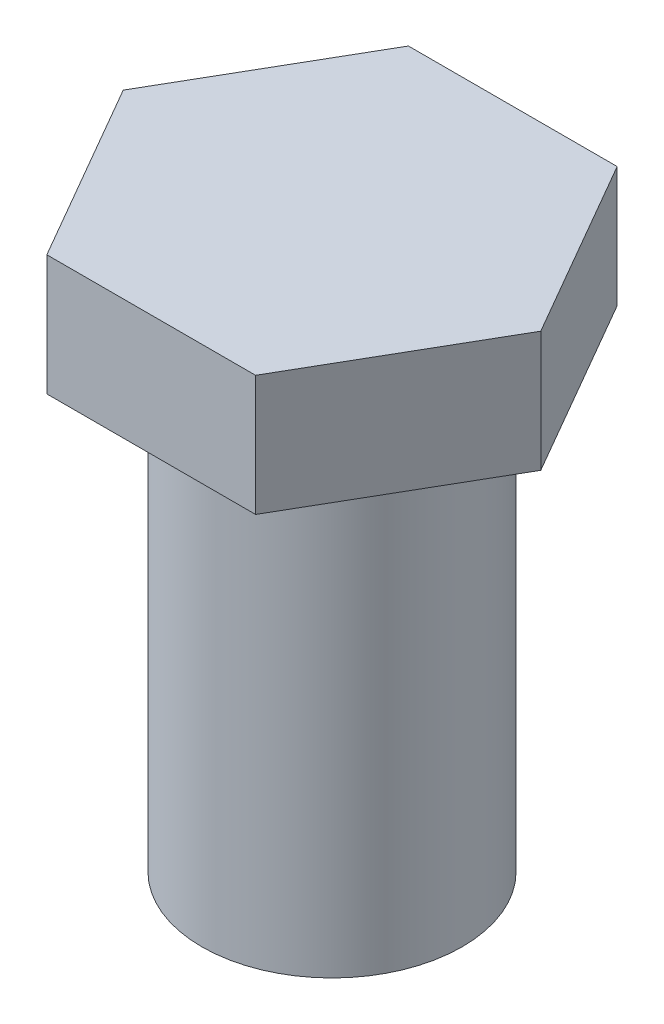
ISO-10303-21;
HEADER;
FILE_DESCRIPTION(('STEP AP214'),'2;1');
FILE_NAME('part.step','',(''),(''),'','','');
FILE_SCHEMA(('AUTOMOTIVE_DESIGN { 1 0 10303 214 1 1 1 1 }'));
ENDSEC;
DATA;
#1=APPLICATION_CONTEXT('core data for automotive mechanical design processes');
#2=APPLICATION_PROTOCOL_DEFINITION('international standard','automotive_design',2000,#1);
#3=PRODUCT_CONTEXT('',#1,'mechanical');
#4=PRODUCT('Part','Part','',(#3));
#5=PRODUCT_RELATED_PRODUCT_CATEGORY('part','',(#4));
#6=PRODUCT_DEFINITION_FORMATION('','',#4);
#7=PRODUCT_DEFINITION_CONTEXT('part definition',#1,'design');
#8=PRODUCT_DEFINITION('design','',#6,#7);
#9=PRODUCT_DEFINITION_SHAPE('','',#8);
#10=(LENGTH_UNIT() NAMED_UNIT(*) SI_UNIT(.MILLI.,.METRE.));
#11=(NAMED_UNIT(*) PLANE_ANGLE_UNIT() SI_UNIT($,.RADIAN.));
#12=(NAMED_UNIT(*) SI_UNIT($,.STERADIAN.) SOLID_ANGLE_UNIT());
#13=UNCERTAINTY_MEASURE_WITH_UNIT(LENGTH_MEASURE(1.E-05),#10,'distance_accuracy_value','');
#14=(GEOMETRIC_REPRESENTATION_CONTEXT(3) GLOBAL_UNCERTAINTY_ASSIGNED_CONTEXT((#13)) GLOBAL_UNIT_ASSIGNED_CONTEXT((#10,
#11,#12)) REPRESENTATION_CONTEXT('',''));
#15=CARTESIAN_POINT('',(0.,0.,0.));
#16=DIRECTION('',(0.,0.,1.));
#17=DIRECTION('',(1.,0.,0.));
#18=AXIS2_PLACEMENT_3D('',#15,#16,#17);
#19=CARTESIAN_POINT('',(0.,-9.525,0.));
#20=DIRECTION('',(0.,1.,0.));
#21=DIRECTION('',(0.,0.,1.));
#22=AXIS2_PLACEMENT_3D('',#19,#20,#21);
#23=CYLINDRICAL_SURFACE('',#22,2.7432);
#24=CARTESIAN_POINT('',(0.,-9.525,0.));
#25=DIRECTION('',(0.,1.,0.));
#26=DIRECTION('',(0.,0.,1.));
#27=AXIS2_PLACEMENT_3D('',#24,#25,#26);
#28=CIRCLE('',#27,2.7432);
#29=CARTESIAN_POINT('',(0.,-9.525,2.7432));
#30=VERTEX_POINT('',#29);
#31=EDGE_CURVE('E11',#30,#30,#28,.T.);
#32=CARTESIAN_POINT('',(0.,0.,0.));
#33=DIRECTION('',(0.,1.,0.));
#34=DIRECTION('',(0.,0.,1.));
#35=AXIS2_PLACEMENT_3D('',#32,#33,#34);
#36=CIRCLE('',#35,2.7432);
#37=CARTESIAN_POINT('',(0.,0.,2.7432));
#38=VERTEX_POINT('',#37);
#39=EDGE_CURVE('E37',#38,#38,#36,.T.);
#40=CARTESIAN_POINT('',(0.,-9.525,2.7432));
#41=CARTESIAN_POINT('',(0.,-9.42578125,2.7432));
#42=CARTESIAN_POINT('',(0.,-9.3265625,2.7432));
#43=CARTESIAN_POINT('',(0.,-9.128125,2.7432));
#44=CARTESIAN_POINT('',(0.,-9.02890625,2.7432));
#45=CARTESIAN_POINT('',(0.,-8.83046875,2.7432));
#46=CARTESIAN_POINT('',(0.,-8.73125,2.7432));
#47=CARTESIAN_POINT('',(0.,-8.5328125,2.7432));
#48=CARTESIAN_POINT('',(0.,-8.43359375,2.7432));
#49=CARTESIAN_POINT('',(0.,-8.23515625,2.7432));
#50=CARTESIAN_POINT('',(0.,-8.1359375,2.7432));
#51=CARTESIAN_POINT('',(0.,-7.9375,2.7432));
#52=CARTESIAN_POINT('',(0.,-7.83828125,2.7432));
#53=CARTESIAN_POINT('',(0.,-7.63984375,2.7432));
#54=CARTESIAN_POINT('',(0.,-7.540625,2.7432));
#55=CARTESIAN_POINT('',(0.,-7.3421875,2.7432));
#56=CARTESIAN_POINT('',(0.,-7.24296875,2.7432));
#57=CARTESIAN_POINT('',(0.,-7.04453125,2.7432));
#58=CARTESIAN_POINT('',(0.,-6.9453125,2.7432));
#59=CARTESIAN_POINT('',(0.,-6.746875,2.7432));
#60=CARTESIAN_POINT('',(0.,-6.64765625,2.7432));
#61=CARTESIAN_POINT('',(0.,-6.44921875,2.7432));
#62=CARTESIAN_POINT('',(0.,-6.35,2.7432));
#63=CARTESIAN_POINT('',(0.,-6.1515625,2.7432));
#64=CARTESIAN_POINT('',(0.,-6.05234375,2.7432));
#65=CARTESIAN_POINT('',(0.,-5.85390625,2.7432));
#66=CARTESIAN_POINT('',(0.,-5.7546875,2.7432));
#67=CARTESIAN_POINT('',(0.,-5.55625,2.7432));
#68=CARTESIAN_POINT('',(0.,-5.45703125,2.7432));
#69=CARTESIAN_POINT('',(0.,-5.25859375,2.7432));
#70=CARTESIAN_POINT('',(0.,-5.159375,2.7432));
#71=CARTESIAN_POINT('',(0.,-4.9609375,2.7432));
#72=CARTESIAN_POINT('',(0.,-4.86171875,2.7432));
#73=CARTESIAN_POINT('',(0.,-4.66328125,2.7432));
#74=CARTESIAN_POINT('',(0.,-4.5640625,2.7432));
#75=CARTESIAN_POINT('',(0.,-4.365625,2.7432));
#76=CARTESIAN_POINT('',(0.,-4.26640625,2.7432));
#77=CARTESIAN_POINT('',(0.,-4.06796875,2.7432));
#78=CARTESIAN_POINT('',(0.,-3.96875,2.7432));
#79=CARTESIAN_POINT('',(0.,-3.7703125,2.7432));
#80=CARTESIAN_POINT('',(0.,-3.67109375,2.7432));
#81=CARTESIAN_POINT('',(0.,-3.47265625,2.7432));
#82=CARTESIAN_POINT('',(0.,-3.3734375,2.7432));
#83=CARTESIAN_POINT('',(0.,-3.175,2.7432));
#84=CARTESIAN_POINT('',(0.,-3.07578125,2.7432));
#85=CARTESIAN_POINT('',(0.,-2.87734375,2.7432));
#86=CARTESIAN_POINT('',(0.,-2.778125,2.7432));
#87=CARTESIAN_POINT('',(0.,-2.5796875,2.7432));
#88=CARTESIAN_POINT('',(0.,-2.48046875,2.7432));
#89=CARTESIAN_POINT('',(0.,-2.28203125,2.7432));
#90=CARTESIAN_POINT('',(0.,-2.1828125,2.7432));
#91=CARTESIAN_POINT('',(0.,-1.984375,2.7432));
#92=CARTESIAN_POINT('',(0.,-1.88515625,2.7432));
#93=CARTESIAN_POINT('',(0.,-1.68671875,2.7432));
#94=CARTESIAN_POINT('',(0.,-1.5875,2.7432));
#95=CARTESIAN_POINT('',(0.,-1.3890625,2.7432));
#96=CARTESIAN_POINT('',(0.,-1.28984375,2.7432));
#97=CARTESIAN_POINT('',(0.,-1.09140625,2.7432));
#98=CARTESIAN_POINT('',(0.,-0.992187500000001,2.7432));
#99=CARTESIAN_POINT('',(0.,-0.793750000000001,2.7432));
#100=CARTESIAN_POINT('',(0.,-0.69453125,2.7432));
#101=CARTESIAN_POINT('',(0.,-0.49609375,2.7432));
#102=CARTESIAN_POINT('',(0.,-0.396875,2.7432));
#103=CARTESIAN_POINT('',(0.,-0.1984375,2.7432));
#104=CARTESIAN_POINT('',(0.,-0.0992187500000001,2.7432));
#105=CARTESIAN_POINT('',(0.,0.,2.7432));
#106=B_SPLINE_CURVE_WITH_KNOTS('',3,(#40,#41,#42,#43,#44,#45,#46,#47,#48,#49,#50,#51,#52,#53,
#54,#55,#56,#57,#58,#59,#60,#61,#62,#63,#64,#65,#66,#67,#68,#69,#70,#71,#72,#73,#74,#75,#76,#77,
#78,#79,#80,#81,#82,#83,#84,#85,#86,#87,#88,#89,#90,#91,#92,#93,#94,#95,#96,#97,#98,#99,#100,
#101,#102,#103,#104,#105),.UNSPECIFIED.,.F.,.F.,(4,2,2,2,2,2,2,2,2,2,2,2,2,2,2,2,2,2,2,2,2,2,2,
2,2,2,2,2,2,2,2,2,4),(0.,0.297656249999998,0.595312499999999,0.892968749999999,1.190625,
1.48828125,1.7859375,2.08359375,2.38125,2.67890625,2.9765625,3.27421875,3.571875,3.86953125,
4.1671875,4.46484375,4.7625,5.06015625,5.3578125,5.65546875,5.953125,6.25078125,6.5484375,
6.84609375,7.14375,7.44140625,7.7390625,8.03671875,8.334375,8.63203125,8.9296875,9.22734375,
9.525),.UNSPECIFIED.);
#107=EDGE_CURVE('BSEAM34',#30,#38,#106,.T.);
#108=ORIENTED_EDGE('',*,*,#31,.T.);
#109=ORIENTED_EDGE('',*,*,#39,.F.);
#110=ORIENTED_EDGE('',*,*,#107,.T.);
#111=ORIENTED_EDGE('',*,*,#107,.F.);
#112=EDGE_LOOP('',(#108,#110,#109,#111));
#113=FACE_BOUND('',#112,.T.);
#114=ADVANCED_FACE('F34',(#113),#23,.T.);
#115=CARTESIAN_POINT('',(0.,-9.525,0.));
#116=DIRECTION('',(0.,1.,0.));
#117=DIRECTION('',(0.,0.,1.));
#118=AXIS2_PLACEMENT_3D('',#115,#116,#117);
#119=PLANE('',#118);
#120=ORIENTED_EDGE('',*,*,#31,.F.);
#121=EDGE_LOOP('',(#120));
#122=FACE_BOUND('',#121,.T.);
#123=ADVANCED_FACE('F145',(#122),#119,.F.);
#124=CARTESIAN_POINT('',(2.19970452561247,2.54,3.81));
#125=DIRECTION('',(-0.866025403784439,0.,-0.5));
#126=DIRECTION('',(-0.5,0.,0.866025403784439));
#127=AXIS2_PLACEMENT_3D('',#124,#125,#126);
#128=PLANE('',#127);
#129=DIRECTION('',(0.5,0.,-0.866025403784439));
#130=VECTOR('',#129,1.);
#131=CARTESIAN_POINT('',(2.19970452561247,0.,3.81));
#132=LINE('',#131,#130);
#133=CARTESIAN_POINT('',(2.19970452561247,0.,3.81));
#134=VERTEX_POINT('',#133);
#135=CARTESIAN_POINT('',(4.39940905122495,0.,0.));
#136=VERTEX_POINT('',#135);
#137=EDGE_CURVE('E119',#134,#136,#132,.T.);
#138=ORIENTED_EDGE('',*,*,#137,.T.);
#139=DIRECTION('',(0.,-1.,0.));
#140=VECTOR('',#139,1.);
#141=CARTESIAN_POINT('',(4.39940905122495,2.54,0.));
#142=LINE('',#141,#140);
#143=CARTESIAN_POINT('',(4.39940905122495,2.54,0.));
#144=VERTEX_POINT('',#143);
#145=EDGE_CURVE('E136',#144,#136,#142,.T.);
#146=ORIENTED_EDGE('',*,*,#145,.F.);
#147=DIRECTION('',(0.5,0.,-0.866025403784439));
#148=VECTOR('',#147,1.);
#149=CARTESIAN_POINT('',(2.19970452561247,2.54,3.81));
#150=LINE('',#149,#148);
#151=CARTESIAN_POINT('',(2.19970452561247,2.54,3.81));
#152=VERTEX_POINT('',#151);
#153=EDGE_CURVE('E129',#152,#144,#150,.T.);
#154=ORIENTED_EDGE('',*,*,#153,.F.);
#155=DIRECTION('',(0.,-1.,0.));
#156=VECTOR('',#155,1.);
#157=CARTESIAN_POINT('',(2.19970452561247,2.54,3.81));
#158=LINE('',#157,#156);
#159=EDGE_CURVE('E115',#152,#134,#158,.T.);
#160=ORIENTED_EDGE('',*,*,#159,.T.);
#161=EDGE_LOOP('',(#138,#146,#154,#160));
#162=FACE_BOUND('',#161,.T.);
#163=ADVANCED_FACE('F150',(#162),#128,.F.);
#164=CARTESIAN_POINT('',(4.39940905122495,2.54,0.));
#165=DIRECTION('',(-0.866025403784438,0.,0.5));
#166=DIRECTION('',(0.5,0.,0.866025403784438));
#167=AXIS2_PLACEMENT_3D('',#164,#165,#166);
#168=PLANE('',#167);
#169=DIRECTION('',(-0.5,0.,-0.866025403784438));
#170=VECTOR('',#169,1.);
#171=CARTESIAN_POINT('',(4.39940905122495,0.,0.));
#172=LINE('',#171,#170);
#173=CARTESIAN_POINT('',(2.19970452561247,0.,-3.81));
#174=VERTEX_POINT('',#173);
#175=EDGE_CURVE('E122',#136,#174,#172,.T.);
#176=ORIENTED_EDGE('',*,*,#175,.T.);
#177=DIRECTION('',(0.,-1.,0.));
#178=VECTOR('',#177,1.);
#179=CARTESIAN_POINT('',(2.19970452561247,2.54,-3.81));
#180=LINE('',#179,#178);
#181=CARTESIAN_POINT('',(2.19970452561247,2.54,-3.81));
#182=VERTEX_POINT('',#181);
#183=EDGE_CURVE('E133',#182,#174,#180,.T.);
#184=ORIENTED_EDGE('',*,*,#183,.F.);
#185=DIRECTION('',(-0.5,0.,-0.866025403784438));
#186=VECTOR('',#185,1.);
#187=CARTESIAN_POINT('',(4.39940905122495,2.54,0.));
#188=LINE('',#187,#186);
#189=EDGE_CURVE('E88',#144,#182,#188,.T.);
#190=ORIENTED_EDGE('',*,*,#189,.F.);
#191=ORIENTED_EDGE('',*,*,#145,.T.);
#192=EDGE_LOOP('',(#176,#184,#190,#191));
#193=FACE_BOUND('',#192,.T.);
#194=ADVANCED_FACE('F156',(#193),#168,.F.);
#195=CARTESIAN_POINT('',(2.19970452561247,2.54,-3.81));
#196=DIRECTION('',(0.,0.,1.));
#197=DIRECTION('',(1.,0.,0.));
#198=AXIS2_PLACEMENT_3D('',#195,#196,#197);
#199=PLANE('',#198);
#200=DIRECTION('',(-1.,0.,0.));
#201=VECTOR('',#200,1.);
#202=CARTESIAN_POINT('',(2.19970452561247,0.,-3.81));
#203=LINE('',#202,#201);
#204=CARTESIAN_POINT('',(-2.19970452561247,0.,-3.81));
#205=VERTEX_POINT('',#204);
#206=EDGE_CURVE('E124',#174,#205,#203,.T.);
#207=ORIENTED_EDGE('',*,*,#206,.T.);
#208=DIRECTION('',(0.,-1.,0.));
#209=VECTOR('',#208,1.);
#210=CARTESIAN_POINT('',(-2.19970452561247,2.54,-3.81));
#211=LINE('',#210,#209);
#212=CARTESIAN_POINT('',(-2.19970452561247,2.54,-3.81));
#213=VERTEX_POINT('',#212);
#214=EDGE_CURVE('E110',#213,#205,#211,.T.);
#215=ORIENTED_EDGE('',*,*,#214,.F.);
#216=DIRECTION('',(-1.,0.,0.));
#217=VECTOR('',#216,1.);
#218=CARTESIAN_POINT('',(2.19970452561247,2.54,-3.81));
#219=LINE('',#218,#217);
#220=EDGE_CURVE('E101',#182,#213,#219,.T.);
#221=ORIENTED_EDGE('',*,*,#220,.F.);
#222=ORIENTED_EDGE('',*,*,#183,.T.);
#223=EDGE_LOOP('',(#207,#215,#221,#222));
#224=FACE_BOUND('',#223,.T.);
#225=ADVANCED_FACE('F162',(#224),#199,.F.);
#226=CARTESIAN_POINT('',(-2.19970452561247,2.54,-3.81));
#227=DIRECTION('',(0.866025403784439,0.,0.5));
#228=DIRECTION('',(0.5,0.,-0.866025403784439));
#229=AXIS2_PLACEMENT_3D('',#226,#227,#228);
#230=PLANE('',#229);
#231=DIRECTION('',(-0.5,0.,0.866025403784439));
#232=VECTOR('',#231,1.);
#233=CARTESIAN_POINT('',(-2.19970452561247,0.,-3.81));
#234=LINE('',#233,#232);
#235=CARTESIAN_POINT('',(-4.39940905122495,0.,0.));
#236=VERTEX_POINT('',#235);
#237=EDGE_CURVE('E109',#205,#236,#234,.T.);
#238=ORIENTED_EDGE('',*,*,#237,.T.);
#239=DIRECTION('',(0.,-1.,0.));
#240=VECTOR('',#239,1.);
#241=CARTESIAN_POINT('',(-4.39940905122495,2.54,0.));
#242=LINE('',#241,#240);
#243=CARTESIAN_POINT('',(-4.39940905122495,2.54,0.));
#244=VERTEX_POINT('',#243);
#245=EDGE_CURVE('E106',#244,#236,#242,.T.);
#246=ORIENTED_EDGE('',*,*,#245,.F.);
#247=DIRECTION('',(-0.5,0.,0.866025403784439));
#248=VECTOR('',#247,1.);
#249=CARTESIAN_POINT('',(-2.19970452561247,2.54,-3.81));
#250=LINE('',#249,#248);
#251=EDGE_CURVE('E95',#213,#244,#250,.T.);
#252=ORIENTED_EDGE('',*,*,#251,.F.);
#253=ORIENTED_EDGE('',*,*,#214,.T.);
#254=EDGE_LOOP('',(#238,#246,#252,#253));
#255=FACE_BOUND('',#254,.T.);
#256=ADVANCED_FACE('F107',(#255),#230,.F.);
#257=CARTESIAN_POINT('',(-4.39940905122495,2.54,0.));
#258=DIRECTION('',(0.866025403784438,0.,-0.5));
#259=DIRECTION('',(-0.5,0.,-0.866025403784439));
#260=AXIS2_PLACEMENT_3D('',#257,#258,#259);
#261=PLANE('',#260);
#262=DIRECTION('',(0.5,0.,0.866025403784438));
#263=VECTOR('',#262,1.);
#264=CARTESIAN_POINT('',(-4.39940905122495,0.,0.));
#265=LINE('',#264,#263);
#266=CARTESIAN_POINT('',(-2.19970452561247,0.,3.81));
#267=VERTEX_POINT('',#266);
#268=EDGE_CURVE('E73',#236,#267,#265,.T.);
#269=ORIENTED_EDGE('',*,*,#268,.T.);
#270=DIRECTION('',(0.,-1.,0.));
#271=VECTOR('',#270,1.);
#272=CARTESIAN_POINT('',(-2.19970452561247,2.54,3.81));
#273=LINE('',#272,#271);
#274=CARTESIAN_POINT('',(-2.19970452561247,2.54,3.81));
#275=VERTEX_POINT('',#274);
#276=EDGE_CURVE('E111',#275,#267,#273,.T.);
#277=ORIENTED_EDGE('',*,*,#276,.F.);
#278=DIRECTION('',(0.5,0.,0.866025403784438));
#279=VECTOR('',#278,1.);
#280=CARTESIAN_POINT('',(-4.39940905122495,2.54,0.));
#281=LINE('',#280,#279);
#282=EDGE_CURVE('E99',#244,#275,#281,.T.);
#283=ORIENTED_EDGE('',*,*,#282,.F.);
#284=ORIENTED_EDGE('',*,*,#245,.T.);
#285=EDGE_LOOP('',(#269,#277,#283,#284));
#286=FACE_BOUND('',#285,.T.);
#287=ADVANCED_FACE('F113',(#286),#261,.F.);
#288=CARTESIAN_POINT('',(-2.19970452561247,2.54,3.81));
#289=DIRECTION('',(0.,0.,-1.));
#290=DIRECTION('',(-1.,0.,0.));
#291=AXIS2_PLACEMENT_3D('',#288,#289,#290);
#292=PLANE('',#291);
#293=DIRECTION('',(1.,0.,0.));
#294=VECTOR('',#293,1.);
#295=CARTESIAN_POINT('',(-2.19970452561247,0.,3.81));
#296=LINE('',#295,#294);
#297=EDGE_CURVE('E79',#267,#134,#296,.T.);
#298=ORIENTED_EDGE('',*,*,#297,.T.);
#299=ORIENTED_EDGE('',*,*,#159,.F.);
#300=DIRECTION('',(1.,0.,0.));
#301=VECTOR('',#300,1.);
#302=CARTESIAN_POINT('',(-2.19970452561247,2.54,3.81));
#303=LINE('',#302,#301);
#304=EDGE_CURVE('E50',#275,#152,#303,.T.);
#305=ORIENTED_EDGE('',*,*,#304,.F.);
#306=ORIENTED_EDGE('',*,*,#276,.T.);
#307=EDGE_LOOP('',(#298,#299,#305,#306));
#308=FACE_BOUND('',#307,.T.);
#309=ADVANCED_FACE('F170',(#308),#292,.F.);
#310=CARTESIAN_POINT('',(0.,2.54,0.));
#311=DIRECTION('',(0.,1.,0.));
#312=DIRECTION('',(0.,0.,1.));
#313=AXIS2_PLACEMENT_3D('',#310,#311,#312);
#314=PLANE('',#313);
#315=ORIENTED_EDGE('',*,*,#153,.T.);
#316=ORIENTED_EDGE('',*,*,#189,.T.);
#317=ORIENTED_EDGE('',*,*,#220,.T.);
#318=ORIENTED_EDGE('',*,*,#251,.T.);
#319=ORIENTED_EDGE('',*,*,#282,.T.);
#320=ORIENTED_EDGE('',*,*,#304,.T.);
#321=EDGE_LOOP('',(#315,#316,#317,#318,#319,#320));
#322=FACE_BOUND('',#321,.T.);
#323=ADVANCED_FACE('F97',(#322),#314,.T.);
#324=CARTESIAN_POINT('',(0.,0.,0.));
#325=DIRECTION('',(0.,1.,0.));
#326=DIRECTION('',(0.,0.,1.));
#327=AXIS2_PLACEMENT_3D('',#324,#325,#326);
#328=PLANE('',#327);
#329=ORIENTED_EDGE('',*,*,#39,.T.);
#330=EDGE_LOOP('',(#329));
#331=FACE_BOUND('',#330,.T.);
#332=ORIENTED_EDGE('',*,*,#137,.F.);
#333=ORIENTED_EDGE('',*,*,#297,.F.);
#334=ORIENTED_EDGE('',*,*,#268,.F.);
#335=ORIENTED_EDGE('',*,*,#237,.F.);
#336=ORIENTED_EDGE('',*,*,#206,.F.);
#337=ORIENTED_EDGE('',*,*,#175,.F.);
#338=EDGE_LOOP('',(#332,#333,#334,#335,#336,#337));
#339=FACE_BOUND('',#338,.T.);
#340=ADVANCED_FACE('F141',(#331,#339),#328,.F.);
#341=CLOSED_SHELL('',(#114,#123,#163,#194,#225,#256,#287,#309,#323,#340));
#342=MANIFOLD_SOLID_BREP('B2',#341);
#343=ADVANCED_BREP_SHAPE_REPRESENTATION('',(#18,#342),#14);
#344=SHAPE_DEFINITION_REPRESENTATION(#9,#343);
ENDSEC;
END-ISO-10303-21;
